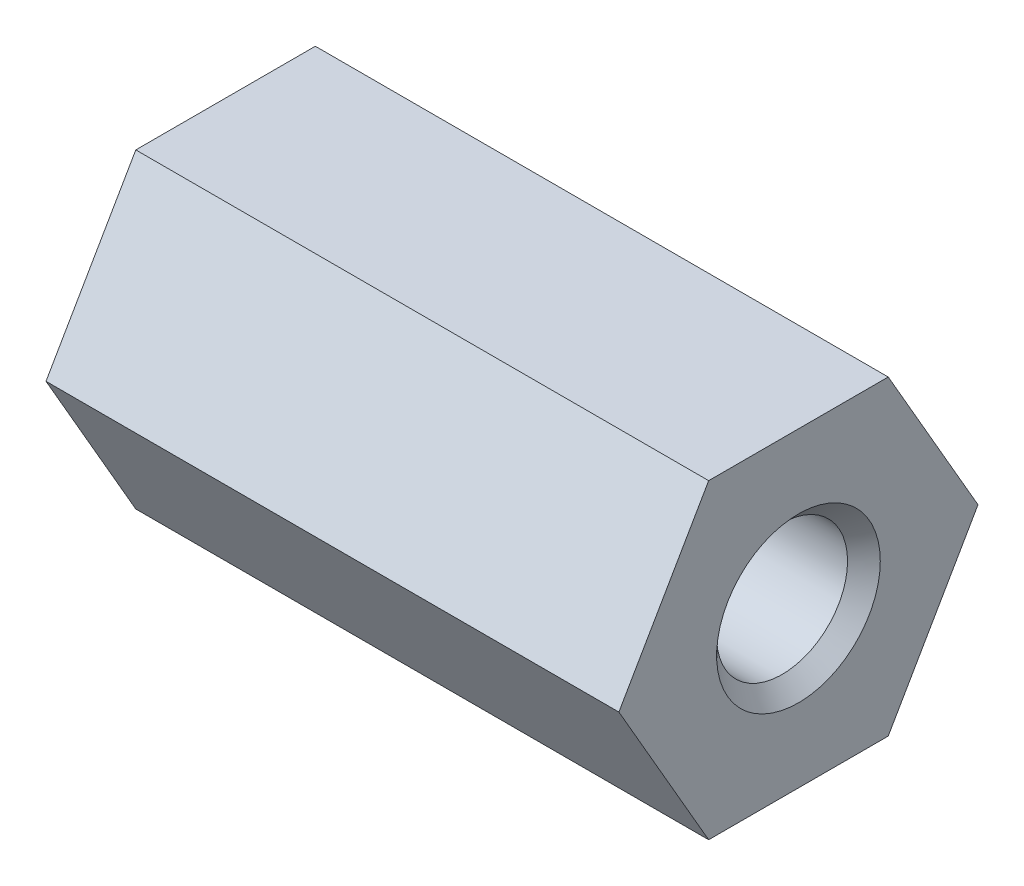
ISO-10303-21;
HEADER;
FILE_DESCRIPTION(('STEP AP214'),'2;1');
FILE_NAME('part.step','',(''),(''),'','','');
FILE_SCHEMA(('AUTOMOTIVE_DESIGN { 1 0 10303 214 1 1 1 1 }'));
ENDSEC;
DATA;
#1=APPLICATION_CONTEXT('core data for automotive mechanical design processes');
#2=APPLICATION_PROTOCOL_DEFINITION('international standard','automotive_design',2000,#1);
#3=PRODUCT_CONTEXT('',#1,'mechanical');
#4=PRODUCT('Part','Part','',(#3));
#5=PRODUCT_RELATED_PRODUCT_CATEGORY('part','',(#4));
#6=PRODUCT_DEFINITION_FORMATION('','',#4);
#7=PRODUCT_DEFINITION_CONTEXT('part definition',#1,'design');
#8=PRODUCT_DEFINITION('design','',#6,#7);
#9=PRODUCT_DEFINITION_SHAPE('','',#8);
#10=(LENGTH_UNIT() NAMED_UNIT(*) SI_UNIT(.MILLI.,.METRE.));
#11=(NAMED_UNIT(*) PLANE_ANGLE_UNIT() SI_UNIT($,.RADIAN.));
#12=(NAMED_UNIT(*) SI_UNIT($,.STERADIAN.) SOLID_ANGLE_UNIT());
#13=UNCERTAINTY_MEASURE_WITH_UNIT(LENGTH_MEASURE(1.E-05),#10,'distance_accuracy_value','');
#14=(GEOMETRIC_REPRESENTATION_CONTEXT(3) GLOBAL_UNCERTAINTY_ASSIGNED_CONTEXT((#13)) GLOBAL_UNIT_ASSIGNED_CONTEXT((#10,
#11,#12)) REPRESENTATION_CONTEXT('',''));
#15=CARTESIAN_POINT('',(0.,0.,0.));
#16=DIRECTION('',(0.,0.,1.));
#17=DIRECTION('',(1.,0.,0.));
#18=AXIS2_PLACEMENT_3D('',#15,#16,#17);
#19=CARTESIAN_POINT('',(35.,4.75,8.22724133595217));
#20=DIRECTION('',(0.,0.5,0.866025403784439));
#21=DIRECTION('',(0.,-0.866025403784439,0.5));
#22=AXIS2_PLACEMENT_3D('',#19,#20,#21);
#23=PLANE('',#22);
#24=DIRECTION('',(0.,0.866025403784439,-0.5));
#25=VECTOR('',#24,1.);
#26=CARTESIAN_POINT('',(0.,4.75,8.22724133595217));
#27=LINE('',#26,#25);
#28=CARTESIAN_POINT('',(0.,0.,10.9696551146029));
#29=VERTEX_POINT('',#28);
#30=CARTESIAN_POINT('',(0.,9.5,5.48482755730145));
#31=VERTEX_POINT('',#30);
#32=EDGE_CURVE('E119',#29,#31,#27,.T.);
#33=ORIENTED_EDGE('',*,*,#32,.F.);
#34=DIRECTION('',(-1.,0.,0.));
#35=VECTOR('',#34,1.);
#36=CARTESIAN_POINT('',(35.,0.,10.9696551146029));
#37=LINE('',#36,#35);
#38=CARTESIAN_POINT('',(35.,0.,10.9696551146029));
#39=VERTEX_POINT('',#38);
#40=EDGE_CURVE('E81',#39,#29,#37,.T.);
#41=ORIENTED_EDGE('',*,*,#40,.F.);
#42=DIRECTION('',(0.,0.866025403784439,-0.5));
#43=VECTOR('',#42,1.);
#44=CARTESIAN_POINT('',(35.,4.75,8.22724133595217));
#45=LINE('',#44,#43);
#46=CARTESIAN_POINT('',(35.,9.5,5.48482755730145));
#47=VERTEX_POINT('',#46);
#48=EDGE_CURVE('E133',#39,#47,#45,.T.);
#49=ORIENTED_EDGE('',*,*,#48,.T.);
#50=DIRECTION('',(-1.,0.,0.));
#51=VECTOR('',#50,1.);
#52=CARTESIAN_POINT('',(35.,9.5,5.48482755730145));
#53=LINE('',#52,#51);
#54=EDGE_CURVE('E52',#47,#31,#53,.T.);
#55=ORIENTED_EDGE('',*,*,#54,.T.);
#56=EDGE_LOOP('',(#33,#41,#49,#55));
#57=FACE_BOUND('',#56,.T.);
#58=ADVANCED_FACE('F35',(#57),#23,.T.);
#59=CARTESIAN_POINT('',(35.,-4.75,8.22724133595217));
#60=DIRECTION('',(0.,-0.5,0.866025403784439));
#61=DIRECTION('',(0.,-0.866025403784439,-0.5));
#62=AXIS2_PLACEMENT_3D('',#59,#60,#61);
#63=PLANE('',#62);
#64=DIRECTION('',(0.,0.866025403784439,0.5));
#65=VECTOR('',#64,1.);
#66=CARTESIAN_POINT('',(0.,-4.75,8.22724133595217));
#67=LINE('',#66,#65);
#68=CARTESIAN_POINT('',(0.,-9.5,5.48482755730145));
#69=VERTEX_POINT('',#68);
#70=EDGE_CURVE('E121',#69,#29,#67,.T.);
#71=ORIENTED_EDGE('',*,*,#70,.F.);
#72=DIRECTION('',(-1.,0.,0.));
#73=VECTOR('',#72,1.);
#74=CARTESIAN_POINT('',(35.,-9.5,5.48482755730145));
#75=LINE('',#74,#73);
#76=CARTESIAN_POINT('',(35.,-9.5,5.48482755730145));
#77=VERTEX_POINT('',#76);
#78=EDGE_CURVE('E137',#77,#69,#75,.T.);
#79=ORIENTED_EDGE('',*,*,#78,.F.);
#80=DIRECTION('',(0.,0.866025403784439,0.5));
#81=VECTOR('',#80,1.);
#82=CARTESIAN_POINT('',(35.,-4.75,8.22724133595217));
#83=LINE('',#82,#81);
#84=EDGE_CURVE('E256',#77,#39,#83,.T.);
#85=ORIENTED_EDGE('',*,*,#84,.T.);
#86=ORIENTED_EDGE('',*,*,#40,.T.);
#87=EDGE_LOOP('',(#71,#79,#85,#86));
#88=FACE_BOUND('',#87,.T.);
#89=ADVANCED_FACE('F173',(#88),#63,.T.);
#90=CARTESIAN_POINT('',(35.,-9.5,0.));
#91=DIRECTION('',(0.,-1.,0.));
#92=DIRECTION('',(0.,0.,-1.));
#93=AXIS2_PLACEMENT_3D('',#90,#91,#92);
#94=PLANE('',#93);
#95=DIRECTION('',(0.,0.,1.));
#96=VECTOR('',#95,1.);
#97=CARTESIAN_POINT('',(0.,-9.5,0.));
#98=LINE('',#97,#96);
#99=CARTESIAN_POINT('',(0.,-9.5,-5.48482755730145));
#100=VERTEX_POINT('',#99);
#101=EDGE_CURVE('E124',#100,#69,#98,.T.);
#102=ORIENTED_EDGE('',*,*,#101,.F.);
#103=DIRECTION('',(-1.,0.,0.));
#104=VECTOR('',#103,1.);
#105=CARTESIAN_POINT('',(35.,-9.5,-5.48482755730145));
#106=LINE('',#105,#104);
#107=CARTESIAN_POINT('',(35.,-9.5,-5.48482755730145));
#108=VERTEX_POINT('',#107);
#109=EDGE_CURVE('E101',#108,#100,#106,.T.);
#110=ORIENTED_EDGE('',*,*,#109,.F.);
#111=DIRECTION('',(0.,0.,1.));
#112=VECTOR('',#111,1.);
#113=CARTESIAN_POINT('',(35.,-9.5,0.));
#114=LINE('',#113,#112);
#115=EDGE_CURVE('E111',#108,#77,#114,.T.);
#116=ORIENTED_EDGE('',*,*,#115,.T.);
#117=ORIENTED_EDGE('',*,*,#78,.T.);
#118=EDGE_LOOP('',(#102,#110,#116,#117));
#119=FACE_BOUND('',#118,.T.);
#120=ADVANCED_FACE('F178',(#119),#94,.T.);
#121=CARTESIAN_POINT('',(35.,-4.75,-8.22724133595217));
#122=DIRECTION('',(0.,-0.5,-0.866025403784439));
#123=DIRECTION('',(0.,0.866025403784439,-0.5));
#124=AXIS2_PLACEMENT_3D('',#121,#122,#123);
#125=PLANE('',#124);
#126=DIRECTION('',(0.,-0.866025403784439,0.5));
#127=VECTOR('',#126,1.);
#128=CARTESIAN_POINT('',(0.,-4.75,-8.22724133595217));
#129=LINE('',#128,#127);
#130=CARTESIAN_POINT('',(0.,0.,-10.9696551146029));
#131=VERTEX_POINT('',#130);
#132=EDGE_CURVE('E97',#131,#100,#129,.T.);
#133=ORIENTED_EDGE('',*,*,#132,.F.);
#134=DIRECTION('',(-1.,0.,0.));
#135=VECTOR('',#134,1.);
#136=CARTESIAN_POINT('',(35.,0.,-10.9696551146029));
#137=LINE('',#136,#135);
#138=CARTESIAN_POINT('',(35.,0.,-10.9696551146029));
#139=VERTEX_POINT('',#138);
#140=EDGE_CURVE('E92',#139,#131,#137,.T.);
#141=ORIENTED_EDGE('',*,*,#140,.F.);
#142=DIRECTION('',(0.,-0.866025403784439,0.5));
#143=VECTOR('',#142,1.);
#144=CARTESIAN_POINT('',(35.,-4.75,-8.22724133595217));
#145=LINE('',#144,#143);
#146=EDGE_CURVE('E95',#139,#108,#145,.T.);
#147=ORIENTED_EDGE('',*,*,#146,.T.);
#148=ORIENTED_EDGE('',*,*,#109,.T.);
#149=EDGE_LOOP('',(#133,#141,#147,#148));
#150=FACE_BOUND('',#149,.T.);
#151=ADVANCED_FACE('F94',(#150),#125,.T.);
#152=CARTESIAN_POINT('',(35.,4.75,-8.22724133595217));
#153=DIRECTION('',(0.,0.5,-0.866025403784439));
#154=DIRECTION('',(0.,0.866025403784439,0.5));
#155=AXIS2_PLACEMENT_3D('',#152,#153,#154);
#156=PLANE('',#155);
#157=DIRECTION('',(0.,-0.866025403784439,-0.5));
#158=VECTOR('',#157,1.);
#159=CARTESIAN_POINT('',(0.,4.75,-8.22724133595217));
#160=LINE('',#159,#158);
#161=CARTESIAN_POINT('',(0.,9.5,-5.48482755730145));
#162=VERTEX_POINT('',#161);
#163=EDGE_CURVE('E128',#162,#131,#160,.T.);
#164=ORIENTED_EDGE('',*,*,#163,.F.);
#165=DIRECTION('',(-1.,0.,0.));
#166=VECTOR('',#165,1.);
#167=CARTESIAN_POINT('',(35.,9.5,-5.48482755730145));
#168=LINE('',#167,#166);
#169=CARTESIAN_POINT('',(35.,9.5,-5.48482755730145));
#170=VERTEX_POINT('',#169);
#171=EDGE_CURVE('E72',#170,#162,#168,.T.);
#172=ORIENTED_EDGE('',*,*,#171,.F.);
#173=DIRECTION('',(0.,-0.866025403784439,-0.5));
#174=VECTOR('',#173,1.);
#175=CARTESIAN_POINT('',(35.,4.75,-8.22724133595217));
#176=LINE('',#175,#174);
#177=EDGE_CURVE('E108',#170,#139,#176,.T.);
#178=ORIENTED_EDGE('',*,*,#177,.T.);
#179=ORIENTED_EDGE('',*,*,#140,.T.);
#180=EDGE_LOOP('',(#164,#172,#178,#179));
#181=FACE_BOUND('',#180,.T.);
#182=ADVANCED_FACE('F113',(#181),#156,.T.);
#183=CARTESIAN_POINT('',(35.,0.,0.));
#184=DIRECTION('',(-1.,0.,0.));
#185=DIRECTION('',(0.,0.,1.));
#186=AXIS2_PLACEMENT_3D('',#183,#184,#185);
#187=CYLINDRICAL_SURFACE('',#186,4.);
#188=CARTESIAN_POINT('',(1.,0.,0.));
#189=DIRECTION('',(1.,0.,0.));
#190=DIRECTION('',(0.,0.,-1.));
#191=AXIS2_PLACEMENT_3D('',#188,#189,#190);
#192=CIRCLE('',#191,4.);
#193=CARTESIAN_POINT('',(1.,0.,-4.));
#194=VERTEX_POINT('',#193);
#195=EDGE_CURVE('E44',#194,#194,#192,.F.);
#196=ORIENTED_EDGE('',*,*,#195,.T.);
#197=EDGE_LOOP('',(#196));
#198=FACE_BOUND('',#197,.T.);
#199=CARTESIAN_POINT('',(34.,0.,0.));
#200=DIRECTION('',(1.,0.,0.));
#201=DIRECTION('',(0.,0.,-1.));
#202=AXIS2_PLACEMENT_3D('',#199,#200,#201);
#203=CIRCLE('',#202,4.);
#204=CARTESIAN_POINT('',(34.,0.,-4.));
#205=VERTEX_POINT('',#204);
#206=EDGE_CURVE('E143',#205,#205,#203,.T.);
#207=ORIENTED_EDGE('',*,*,#206,.T.);
#208=EDGE_LOOP('',(#207));
#209=FACE_BOUND('',#208,.T.);
#210=ADVANCED_FACE('F148',(#198,#209),#187,.F.);
#211=CARTESIAN_POINT('',(35.,9.5,0.));
#212=DIRECTION('',(0.,1.,0.));
#213=DIRECTION('',(0.,0.,1.));
#214=AXIS2_PLACEMENT_3D('',#211,#212,#213);
#215=PLANE('',#214);
#216=DIRECTION('',(0.,0.,-1.));
#217=VECTOR('',#216,1.);
#218=CARTESIAN_POINT('',(0.,9.5,0.));
#219=LINE('',#218,#217);
#220=EDGE_CURVE('E130',#31,#162,#219,.T.);
#221=ORIENTED_EDGE('',*,*,#220,.F.);
#222=ORIENTED_EDGE('',*,*,#54,.F.);
#223=DIRECTION('',(0.,0.,-1.));
#224=VECTOR('',#223,1.);
#225=CARTESIAN_POINT('',(35.,9.5,0.));
#226=LINE('',#225,#224);
#227=EDGE_CURVE('E114',#47,#170,#226,.T.);
#228=ORIENTED_EDGE('',*,*,#227,.T.);
#229=ORIENTED_EDGE('',*,*,#171,.T.);
#230=EDGE_LOOP('',(#221,#222,#228,#229));
#231=FACE_BOUND('',#230,.T.);
#232=ADVANCED_FACE('F161',(#231),#215,.T.);
#233=CARTESIAN_POINT('',(35.,0.,0.));
#234=DIRECTION('',(1.,0.,0.));
#235=DIRECTION('',(0.,0.,-1.));
#236=AXIS2_PLACEMENT_3D('',#233,#234,#235);
#237=PLANE('',#236);
#238=CARTESIAN_POINT('',(35.,0.,0.));
#239=DIRECTION('',(1.,0.,0.));
#240=DIRECTION('',(0.,0.,-1.));
#241=AXIS2_PLACEMENT_3D('',#238,#239,#240);
#242=CIRCLE('',#241,5.);
#243=CARTESIAN_POINT('',(35.,0.,-5.));
#244=VERTEX_POINT('',#243);
#245=EDGE_CURVE('E11',#244,#244,#242,.F.);
#246=ORIENTED_EDGE('',*,*,#245,.T.);
#247=EDGE_LOOP('',(#246));
#248=FACE_BOUND('',#247,.T.);
#249=ORIENTED_EDGE('',*,*,#48,.F.);
#250=ORIENTED_EDGE('',*,*,#84,.F.);
#251=ORIENTED_EDGE('',*,*,#115,.F.);
#252=ORIENTED_EDGE('',*,*,#146,.F.);
#253=ORIENTED_EDGE('',*,*,#177,.F.);
#254=ORIENTED_EDGE('',*,*,#227,.F.);
#255=EDGE_LOOP('',(#249,#250,#251,#252,#253,#254));
#256=FACE_BOUND('',#255,.T.);
#257=ADVANCED_FACE('F106',(#248,#256),#237,.T.);
#258=CARTESIAN_POINT('',(0.,0.,0.));
#259=DIRECTION('',(1.,0.,0.));
#260=DIRECTION('',(0.,0.,-1.));
#261=AXIS2_PLACEMENT_3D('',#258,#259,#260);
#262=PLANE('',#261);
#263=CARTESIAN_POINT('',(0.,0.,0.));
#264=DIRECTION('',(1.,0.,0.));
#265=DIRECTION('',(0.,0.,-1.));
#266=AXIS2_PLACEMENT_3D('',#263,#264,#265);
#267=CIRCLE('',#266,5.);
#268=CARTESIAN_POINT('',(0.,0.,-5.));
#269=VERTEX_POINT('',#268);
#270=EDGE_CURVE('E140',#269,#269,#267,.T.);
#271=ORIENTED_EDGE('',*,*,#270,.T.);
#272=EDGE_LOOP('',(#271));
#273=FACE_BOUND('',#272,.T.);
#274=ORIENTED_EDGE('',*,*,#32,.T.);
#275=ORIENTED_EDGE('',*,*,#220,.T.);
#276=ORIENTED_EDGE('',*,*,#163,.T.);
#277=ORIENTED_EDGE('',*,*,#132,.T.);
#278=ORIENTED_EDGE('',*,*,#101,.T.);
#279=ORIENTED_EDGE('',*,*,#70,.T.);
#280=EDGE_LOOP('',(#274,#275,#276,#277,#278,#279));
#281=FACE_BOUND('',#280,.T.);
#282=ADVANCED_FACE('F154',(#273,#281),#262,.F.);
#283=CARTESIAN_POINT('',(0.,0.,0.));
#284=DIRECTION('',(-1.,0.,0.));
#285=DIRECTION('',(0.,0.,1.));
#286=AXIS2_PLACEMENT_3D('',#283,#284,#285);
#287=CONICAL_SURFACE('',#286,5.,0.785398163397447);
#288=ORIENTED_EDGE('',*,*,#195,.F.);
#289=EDGE_LOOP('',(#288));
#290=FACE_BOUND('',#289,.T.);
#291=ORIENTED_EDGE('',*,*,#270,.F.);
#292=EDGE_LOOP('',(#291));
#293=FACE_BOUND('',#292,.T.);
#294=ADVANCED_FACE('F151',(#290,#293),#287,.F.);
#295=CARTESIAN_POINT('',(34.,0.,0.));
#296=DIRECTION('',(1.,0.,0.));
#297=DIRECTION('',(0.,0.,-1.));
#298=AXIS2_PLACEMENT_3D('',#295,#296,#297);
#299=CONICAL_SURFACE('',#298,4.,0.78539816339745);
#300=ORIENTED_EDGE('',*,*,#245,.F.);
#301=EDGE_LOOP('',(#300));
#302=FACE_BOUND('',#301,.T.);
#303=ORIENTED_EDGE('',*,*,#206,.F.);
#304=EDGE_LOOP('',(#303));
#305=FACE_BOUND('',#304,.T.);
#306=ADVANCED_FACE('F37',(#302,#305),#299,.F.);
#307=CLOSED_SHELL('',(#58,#89,#120,#151,#182,#210,#232,#257,#282,#294,#306));
#308=MANIFOLD_SOLID_BREP('B2',#307);
#309=ADVANCED_BREP_SHAPE_REPRESENTATION('',(#18,#308),#14);
#310=SHAPE_DEFINITION_REPRESENTATION(#9,#309);
ENDSEC;
END-ISO-10303-21;
